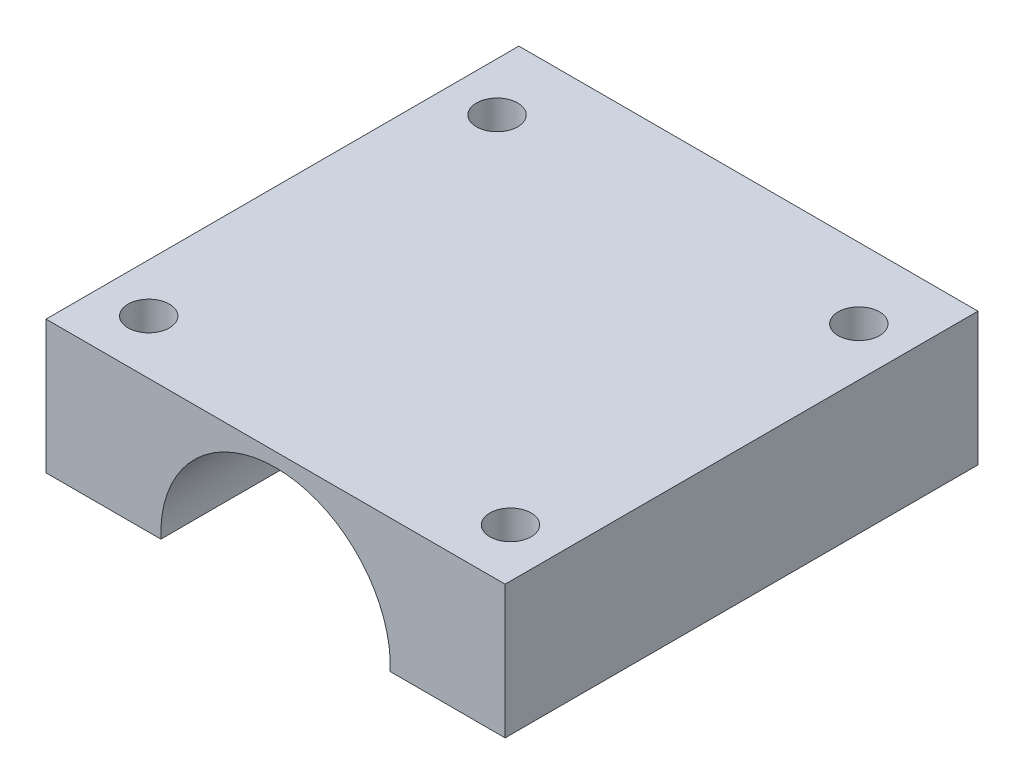
ISO-10303-21;
HEADER;
FILE_DESCRIPTION(('STEP AP214'),'2;1');
FILE_NAME('part.step','',(''),(''),'','','');
FILE_SCHEMA(('AUTOMOTIVE_DESIGN { 1 0 10303 214 1 1 1 1 }'));
ENDSEC;
DATA;
#1=APPLICATION_CONTEXT('core data for automotive mechanical design processes');
#2=APPLICATION_PROTOCOL_DEFINITION('international standard','automotive_design',2000,#1);
#3=PRODUCT_CONTEXT('',#1,'mechanical');
#4=PRODUCT('Part','Part','',(#3));
#5=PRODUCT_RELATED_PRODUCT_CATEGORY('part','',(#4));
#6=PRODUCT_DEFINITION_FORMATION('','',#4);
#7=PRODUCT_DEFINITION_CONTEXT('part definition',#1,'design');
#8=PRODUCT_DEFINITION('design','',#6,#7);
#9=PRODUCT_DEFINITION_SHAPE('','',#8);
#10=(LENGTH_UNIT() NAMED_UNIT(*) SI_UNIT(.MILLI.,.METRE.));
#11=(NAMED_UNIT(*) PLANE_ANGLE_UNIT() SI_UNIT($,.RADIAN.));
#12=(NAMED_UNIT(*) SI_UNIT($,.STERADIAN.) SOLID_ANGLE_UNIT());
#13=UNCERTAINTY_MEASURE_WITH_UNIT(LENGTH_MEASURE(1.E-05),#10,'distance_accuracy_value','');
#14=(GEOMETRIC_REPRESENTATION_CONTEXT(3) GLOBAL_UNCERTAINTY_ASSIGNED_CONTEXT((#13)) GLOBAL_UNIT_ASSIGNED_CONTEXT((#10,
#11,#12)) REPRESENTATION_CONTEXT('',''));
#15=CARTESIAN_POINT('',(0.,0.,0.));
#16=DIRECTION('',(0.,0.,1.));
#17=DIRECTION('',(1.,0.,0.));
#18=AXIS2_PLACEMENT_3D('',#15,#16,#17);
#19=CARTESIAN_POINT('',(0.,-0.499999999999995,0.));
#20=DIRECTION('',(0.,1.,0.));
#21=DIRECTION('',(0.,0.,1.));
#22=AXIS2_PLACEMENT_3D('',#19,#20,#21);
#23=PLANE('',#22);
#24=DIRECTION('',(0.,0.,1.));
#25=VECTOR('',#24,1.);
#26=CARTESIAN_POINT('',(-3.71651718682963,-0.499999999999995,-1.5));
#27=LINE('',#26,#25);
#28=CARTESIAN_POINT('',(-3.71651718682963,-0.499999999999995,-1.5));
#29=VERTEX_POINT('',#28);
#30=CARTESIAN_POINT('',(-3.71651718682963,-0.499999999999995,0.));
#31=VERTEX_POINT('',#30);
#32=EDGE_CURVE('E207',#29,#31,#27,.T.);
#33=ORIENTED_EDGE('',*,*,#32,.T.);
#34=DIRECTION('',(-1.,0.,0.));
#35=VECTOR('',#34,1.);
#36=CARTESIAN_POINT('',(0.,-0.499999999999995,0.));
#37=LINE('',#36,#35);
#38=CARTESIAN_POINT('',(-6.87519231907281,-0.499999999999995,0.));
#39=VERTEX_POINT('',#38);
#40=EDGE_CURVE('E208',#31,#39,#37,.T.);
#41=ORIENTED_EDGE('',*,*,#40,.T.);
#42=DIRECTION('',(0.,0.,-1.));
#43=VECTOR('',#42,1.);
#44=CARTESIAN_POINT('',(-6.87519231907281,-0.499999999999995,-1.5));
#45=LINE('',#44,#43);
#46=CARTESIAN_POINT('',(-6.87519231907281,-0.499999999999996,-1.5));
#47=VERTEX_POINT('',#46);
#48=EDGE_CURVE('E220',#47,#39,#45,.F.);
#49=ORIENTED_EDGE('',*,*,#48,.F.);
#50=DIRECTION('',(-1.,0.,0.));
#51=VECTOR('',#50,1.);
#52=CARTESIAN_POINT('',(0.,-0.499999999999995,-1.5));
#53=LINE('',#52,#51);
#54=EDGE_CURVE('E259',#29,#47,#53,.T.);
#55=ORIENTED_EDGE('',*,*,#54,.F.);
#56=EDGE_LOOP('',(#33,#41,#49,#55));
#57=FACE_BOUND('',#56,.T.);
#58=ADVANCED_FACE('F39',(#57),#23,.F.);
#59=CARTESIAN_POINT('',(-19.6986749407734,-0.499999999999995,6.17682172326088));
#60=DIRECTION('',(0.,1.,0.));
#61=DIRECTION('',(0.,0.,1.));
#62=AXIS2_PLACEMENT_3D('',#59,#60,#61);
#63=CIRCLE('',#62,2.25);
#64=CARTESIAN_POINT('',(-19.6986749407734,-0.499999999999995,8.42682172326087));
#65=VERTEX_POINT('',#64);
#66=EDGE_CURVE('E227',#65,#65,#63,.F.);
#67=ORIENTED_EDGE('',*,*,#66,.F.);
#68=EDGE_LOOP('',(#67));
#69=FACE_BOUND('',#68,.T.);
#70=DIRECTION('',(-1.,0.,0.));
#71=VECTOR('',#70,1.);
#72=CARTESIAN_POINT('',(0.,-0.499999999999995,50.));
#73=LINE('',#72,#71);
#74=CARTESIAN_POINT('',(-12.4899959967968,-0.499999999999995,50.));
#75=VERTEX_POINT('',#74);
#76=CARTESIAN_POINT('',(-25.,-0.500000000000001,50.));
#77=VERTEX_POINT('',#76);
#78=EDGE_CURVE('E216',#75,#77,#73,.T.);
#79=ORIENTED_EDGE('',*,*,#78,.T.);
#80=DIRECTION('',(0.,0.,-1.));
#81=VECTOR('',#80,1.);
#82=CARTESIAN_POINT('',(-25.,-0.500000000000001,50.));
#83=LINE('',#82,#81);
#84=CARTESIAN_POINT('',(-25.,-0.500000000000001,-1.5));
#85=VERTEX_POINT('',#84);
#86=EDGE_CURVE('E11',#77,#85,#83,.T.);
#87=ORIENTED_EDGE('',*,*,#86,.T.);
#88=CARTESIAN_POINT('',(-10.1248076809272,-0.499999999999996,-1.5));
#89=VERTEX_POINT('',#88);
#90=EDGE_CURVE('E56',#89,#85,#53,.T.);
#91=ORIENTED_EDGE('',*,*,#90,.F.);
#92=DIRECTION('',(0.,0.,-1.));
#93=VECTOR('',#92,1.);
#94=CARTESIAN_POINT('',(-10.1248076809272,-0.499999999999995,-1.5));
#95=LINE('',#94,#93);
#96=CARTESIAN_POINT('',(-10.1248076809272,-0.499999999999995,0.));
#97=VERTEX_POINT('',#96);
#98=EDGE_CURVE('E202',#97,#89,#95,.T.);
#99=ORIENTED_EDGE('',*,*,#98,.F.);
#100=CARTESIAN_POINT('',(-12.4899959967968,-0.499999999999995,0.));
#101=VERTEX_POINT('',#100);
#102=EDGE_CURVE('E204',#97,#101,#37,.T.);
#103=ORIENTED_EDGE('',*,*,#102,.T.);
#104=DIRECTION('',(0.,0.,-1.));
#105=VECTOR('',#104,1.);
#106=CARTESIAN_POINT('',(-12.4899959967968,-0.499999999999995,50.));
#107=LINE('',#106,#105);
#108=EDGE_CURVE('E215',#101,#75,#107,.F.);
#109=ORIENTED_EDGE('',*,*,#108,.T.);
#110=EDGE_LOOP('',(#79,#87,#91,#99,#103,#109));
#111=FACE_BOUND('',#110,.T.);
#112=CARTESIAN_POINT('',(-19.6986749407734,-0.499999999999995,44.1150104980837));
#113=DIRECTION('',(0.,1.,0.));
#114=DIRECTION('',(0.,0.,1.));
#115=AXIS2_PLACEMENT_3D('',#112,#113,#114);
#116=CIRCLE('',#115,2.25);
#117=CARTESIAN_POINT('',(-19.6986749407734,-0.499999999999995,46.3650104980837));
#118=VERTEX_POINT('',#117);
#119=EDGE_CURVE('E229',#118,#118,#116,.F.);
#120=ORIENTED_EDGE('',*,*,#119,.F.);
#121=EDGE_LOOP('',(#120));
#122=FACE_BOUND('',#121,.T.);
#123=ADVANCED_FACE('F239',(#69,#111,#122),#23,.F.);
#124=CARTESIAN_POINT('',(19.6986749407734,-0.499999999999995,6.17682172326088));
#125=DIRECTION('',(0.,1.,0.));
#126=DIRECTION('',(0.,0.,1.));
#127=AXIS2_PLACEMENT_3D('',#124,#125,#126);
#128=CIRCLE('',#127,2.25);
#129=CARTESIAN_POINT('',(19.6986749407734,-0.499999999999995,8.42682172326087));
#130=VERTEX_POINT('',#129);
#131=EDGE_CURVE('E152',#130,#130,#128,.F.);
#132=ORIENTED_EDGE('',*,*,#131,.F.);
#133=EDGE_LOOP('',(#132));
#134=FACE_BOUND('',#133,.T.);
#135=CARTESIAN_POINT('',(25.,-0.499999999999995,50.));
#136=VERTEX_POINT('',#135);
#137=CARTESIAN_POINT('',(12.4899959967968,-0.499999999999995,50.));
#138=VERTEX_POINT('',#137);
#139=EDGE_CURVE('E218',#136,#138,#73,.T.);
#140=ORIENTED_EDGE('',*,*,#139,.T.);
#141=DIRECTION('',(0.,0.,-1.));
#142=VECTOR('',#141,1.);
#143=CARTESIAN_POINT('',(12.4899959967968,-0.499999999999995,50.));
#144=LINE('',#143,#142);
#145=CARTESIAN_POINT('',(12.4899959967968,-0.499999999999995,0.));
#146=VERTEX_POINT('',#145);
#147=EDGE_CURVE('E212',#138,#146,#144,.T.);
#148=ORIENTED_EDGE('',*,*,#147,.T.);
#149=CARTESIAN_POINT('',(10.1248076809272,-0.499999999999995,0.));
#150=VERTEX_POINT('',#149);
#151=EDGE_CURVE('E209',#146,#150,#37,.T.);
#152=ORIENTED_EDGE('',*,*,#151,.T.);
#153=DIRECTION('',(0.,0.,-1.));
#154=VECTOR('',#153,1.);
#155=CARTESIAN_POINT('',(10.1248076809272,-0.499999999999995,-1.5));
#156=LINE('',#155,#154);
#157=CARTESIAN_POINT('',(10.1248076809272,-0.499999999999996,-1.5));
#158=VERTEX_POINT('',#157);
#159=EDGE_CURVE('E149',#158,#150,#156,.F.);
#160=ORIENTED_EDGE('',*,*,#159,.F.);
#161=CARTESIAN_POINT('',(25.,-0.499999999999995,-1.5));
#162=VERTEX_POINT('',#161);
#163=EDGE_CURVE('E145',#162,#158,#53,.T.);
#164=ORIENTED_EDGE('',*,*,#163,.F.);
#165=DIRECTION('',(0.,0.,-1.));
#166=VECTOR('',#165,1.);
#167=CARTESIAN_POINT('',(25.,-0.499999999999995,50.));
#168=LINE('',#167,#166);
#169=EDGE_CURVE('E131',#136,#162,#168,.T.);
#170=ORIENTED_EDGE('',*,*,#169,.F.);
#171=EDGE_LOOP('',(#140,#148,#152,#160,#164,#170));
#172=FACE_BOUND('',#171,.T.);
#173=CARTESIAN_POINT('',(19.6986749407734,-0.499999999999995,44.1150104980837));
#174=DIRECTION('',(0.,1.,0.));
#175=DIRECTION('',(0.,0.,1.));
#176=AXIS2_PLACEMENT_3D('',#173,#174,#175);
#177=CIRCLE('',#176,2.25);
#178=CARTESIAN_POINT('',(19.6986749407734,-0.499999999999995,46.3650104980837));
#179=VERTEX_POINT('',#178);
#180=EDGE_CURVE('E43',#179,#179,#177,.F.);
#181=ORIENTED_EDGE('',*,*,#180,.F.);
#182=EDGE_LOOP('',(#181));
#183=FACE_BOUND('',#182,.T.);
#184=ADVANCED_FACE('F146',(#134,#172,#183),#23,.F.);
#185=DIRECTION('',(0.,0.,1.));
#186=VECTOR('',#185,1.);
#187=CARTESIAN_POINT('',(3.71651718682963,-0.499999999999995,-1.5));
#188=LINE('',#187,#186);
#189=CARTESIAN_POINT('',(3.71651718682963,-0.499999999999995,0.));
#190=VERTEX_POINT('',#189);
#191=CARTESIAN_POINT('',(3.71651718682963,-0.499999999999995,-1.5));
#192=VERTEX_POINT('',#191);
#193=EDGE_CURVE('E48',#190,#192,#188,.F.);
#194=ORIENTED_EDGE('',*,*,#193,.T.);
#195=CARTESIAN_POINT('',(6.87519231907281,-0.499999999999996,-1.5));
#196=VERTEX_POINT('',#195);
#197=EDGE_CURVE('E153',#196,#192,#53,.T.);
#198=ORIENTED_EDGE('',*,*,#197,.F.);
#199=DIRECTION('',(0.,0.,-1.));
#200=VECTOR('',#199,1.);
#201=CARTESIAN_POINT('',(6.87519231907281,-0.499999999999995,-1.5));
#202=LINE('',#201,#200);
#203=CARTESIAN_POINT('',(6.87519231907281,-0.499999999999995,0.));
#204=VERTEX_POINT('',#203);
#205=EDGE_CURVE('E195',#204,#196,#202,.T.);
#206=ORIENTED_EDGE('',*,*,#205,.F.);
#207=EDGE_CURVE('E277',#204,#190,#37,.T.);
#208=ORIENTED_EDGE('',*,*,#207,.T.);
#209=EDGE_LOOP('',(#194,#198,#206,#208));
#210=FACE_BOUND('',#209,.T.);
#211=ADVANCED_FACE('F41',(#210),#23,.F.);
#212=CARTESIAN_POINT('',(0.,0.,50.));
#213=DIRECTION('',(0.,0.,-1.));
#214=DIRECTION('',(-1.,0.,0.));
#215=AXIS2_PLACEMENT_3D('',#212,#213,#214);
#216=CYLINDRICAL_SURFACE('',#215,12.5);
#217=ORIENTED_EDGE('',*,*,#147,.F.);
#218=CARTESIAN_POINT('',(0.,0.,50.));
#219=DIRECTION('',(0.,0.,1.));
#220=DIRECTION('',(1.,0.,0.));
#221=AXIS2_PLACEMENT_3D('',#218,#219,#220);
#222=CIRCLE('',#221,12.5);
#223=EDGE_CURVE('E188',#138,#75,#222,.T.);
#224=ORIENTED_EDGE('',*,*,#223,.T.);
#225=ORIENTED_EDGE('',*,*,#108,.F.);
#226=CARTESIAN_POINT('',(0.,0.,0.));
#227=DIRECTION('',(0.,0.,1.));
#228=DIRECTION('',(1.,0.,0.));
#229=AXIS2_PLACEMENT_3D('',#226,#227,#228);
#230=CIRCLE('',#229,12.5);
#231=EDGE_CURVE('E181',#146,#101,#230,.T.);
#232=ORIENTED_EDGE('',*,*,#231,.F.);
#233=EDGE_LOOP('',(#217,#224,#225,#232));
#234=FACE_BOUND('',#233,.T.);
#235=ADVANCED_FACE('F245',(#234),#216,.F.);
#236=CARTESIAN_POINT('',(0.,14.,50.));
#237=DIRECTION('',(0.,1.,0.));
#238=DIRECTION('',(0.,0.,1.));
#239=AXIS2_PLACEMENT_3D('',#236,#237,#238);
#240=PLANE('',#239);
#241=CARTESIAN_POINT('',(19.6986749407734,14.,6.17682172326088));
#242=DIRECTION('',(0.,-1.,0.));
#243=DIRECTION('',(0.,0.,-1.));
#244=AXIS2_PLACEMENT_3D('',#241,#242,#243);
#245=CIRCLE('',#244,2.24999999999999);
#246=CARTESIAN_POINT('',(19.6986749407734,14.,3.92682172326089));
#247=VERTEX_POINT('',#246);
#248=EDGE_CURVE('E169',#247,#247,#245,.T.);
#249=ORIENTED_EDGE('',*,*,#248,.T.);
#250=EDGE_LOOP('',(#249));
#251=FACE_BOUND('',#250,.T.);
#252=CARTESIAN_POINT('',(-19.6986749407734,14.,6.17682172326088));
#253=DIRECTION('',(0.,-1.,0.));
#254=DIRECTION('',(0.,0.,-1.));
#255=AXIS2_PLACEMENT_3D('',#252,#253,#254);
#256=CIRCLE('',#255,2.24999999999999);
#257=CARTESIAN_POINT('',(-19.6986749407734,14.,3.92682172326089));
#258=VERTEX_POINT('',#257);
#259=EDGE_CURVE('E172',#258,#258,#256,.T.);
#260=ORIENTED_EDGE('',*,*,#259,.T.);
#261=EDGE_LOOP('',(#260));
#262=FACE_BOUND('',#261,.T.);
#263=CARTESIAN_POINT('',(-19.6986749407734,14.,44.1150104980837));
#264=DIRECTION('',(0.,-1.,0.));
#265=DIRECTION('',(0.,0.,-1.));
#266=AXIS2_PLACEMENT_3D('',#263,#264,#265);
#267=CIRCLE('',#266,2.24999999999999);
#268=CARTESIAN_POINT('',(-19.6986749407734,14.,41.8650104980837));
#269=VERTEX_POINT('',#268);
#270=EDGE_CURVE('E175',#269,#269,#267,.T.);
#271=ORIENTED_EDGE('',*,*,#270,.T.);
#272=EDGE_LOOP('',(#271));
#273=FACE_BOUND('',#272,.T.);
#274=CARTESIAN_POINT('',(19.6986749407734,14.,44.1150104980837));
#275=DIRECTION('',(0.,-1.,0.));
#276=DIRECTION('',(0.,0.,-1.));
#277=AXIS2_PLACEMENT_3D('',#274,#275,#276);
#278=CIRCLE('',#277,2.24999999999999);
#279=CARTESIAN_POINT('',(19.6986749407734,14.,41.8650104980837));
#280=VERTEX_POINT('',#279);
#281=EDGE_CURVE('E178',#280,#280,#278,.T.);
#282=ORIENTED_EDGE('',*,*,#281,.T.);
#283=EDGE_LOOP('',(#282));
#284=FACE_BOUND('',#283,.T.);
#285=DIRECTION('',(0.,0.,-1.));
#286=VECTOR('',#285,1.);
#287=CARTESIAN_POINT('',(25.,14.,50.));
#288=LINE('',#287,#286);
#289=CARTESIAN_POINT('',(25.,14.,50.));
#290=VERTEX_POINT('',#289);
#291=CARTESIAN_POINT('',(25.,14.,-1.5));
#292=VERTEX_POINT('',#291);
#293=EDGE_CURVE('E142',#290,#292,#288,.T.);
#294=ORIENTED_EDGE('',*,*,#293,.T.);
#295=DIRECTION('',(1.,0.,0.));
#296=VECTOR('',#295,1.);
#297=CARTESIAN_POINT('',(25.,14.,-1.5));
#298=LINE('',#297,#296);
#299=CARTESIAN_POINT('',(-25.,14.,-1.5));
#300=VERTEX_POINT('',#299);
#301=EDGE_CURVE('E158',#300,#292,#298,.T.);
#302=ORIENTED_EDGE('',*,*,#301,.F.);
#303=DIRECTION('',(0.,0.,-1.));
#304=VECTOR('',#303,1.);
#305=CARTESIAN_POINT('',(-25.,14.,50.));
#306=LINE('',#305,#304);
#307=CARTESIAN_POINT('',(-25.,14.,50.));
#308=VERTEX_POINT('',#307);
#309=EDGE_CURVE('E141',#308,#300,#306,.T.);
#310=ORIENTED_EDGE('',*,*,#309,.F.);
#311=DIRECTION('',(1.,0.,0.));
#312=VECTOR('',#311,1.);
#313=CARTESIAN_POINT('',(0.,14.,50.));
#314=LINE('',#313,#312);
#315=EDGE_CURVE('E182',#308,#290,#314,.T.);
#316=ORIENTED_EDGE('',*,*,#315,.T.);
#317=EDGE_LOOP('',(#294,#302,#310,#316));
#318=FACE_BOUND('',#317,.T.);
#319=ADVANCED_FACE('F309',(#251,#262,#273,#284,#318),#240,.T.);
#320=CARTESIAN_POINT('',(-25.,0.,50.));
#321=DIRECTION('',(-1.,0.,0.));
#322=DIRECTION('',(0.,0.,1.));
#323=AXIS2_PLACEMENT_3D('',#320,#321,#322);
#324=PLANE('',#323);
#325=ORIENTED_EDGE('',*,*,#309,.T.);
#326=DIRECTION('',(0.,1.,0.));
#327=VECTOR('',#326,1.);
#328=CARTESIAN_POINT('',(-25.,14.,-1.5));
#329=LINE('',#328,#327);
#330=EDGE_CURVE('E159',#85,#300,#329,.T.);
#331=ORIENTED_EDGE('',*,*,#330,.F.);
#332=ORIENTED_EDGE('',*,*,#86,.F.);
#333=DIRECTION('',(0.,1.,0.));
#334=VECTOR('',#333,1.);
#335=CARTESIAN_POINT('',(-25.,0.,50.));
#336=LINE('',#335,#334);
#337=EDGE_CURVE('E185',#77,#308,#336,.T.);
#338=ORIENTED_EDGE('',*,*,#337,.T.);
#339=EDGE_LOOP('',(#325,#331,#332,#338));
#340=FACE_BOUND('',#339,.T.);
#341=ADVANCED_FACE('F288',(#340),#324,.T.);
#342=CARTESIAN_POINT('',(25.,0.,50.));
#343=DIRECTION('',(1.,0.,0.));
#344=DIRECTION('',(0.,1.,0.));
#345=AXIS2_PLACEMENT_3D('',#342,#343,#344);
#346=PLANE('',#345);
#347=ORIENTED_EDGE('',*,*,#169,.T.);
#348=DIRECTION('',(0.,-1.,0.));
#349=VECTOR('',#348,1.);
#350=CARTESIAN_POINT('',(25.,-0.499999999999995,-1.5));
#351=LINE('',#350,#349);
#352=EDGE_CURVE('E135',#292,#162,#351,.T.);
#353=ORIENTED_EDGE('',*,*,#352,.F.);
#354=ORIENTED_EDGE('',*,*,#293,.F.);
#355=DIRECTION('',(0.,-1.,0.));
#356=VECTOR('',#355,1.);
#357=CARTESIAN_POINT('',(25.,0.,50.));
#358=LINE('',#357,#356);
#359=EDGE_CURVE('E137',#290,#136,#358,.T.);
#360=ORIENTED_EDGE('',*,*,#359,.T.);
#361=EDGE_LOOP('',(#347,#353,#354,#360));
#362=FACE_BOUND('',#361,.T.);
#363=ADVANCED_FACE('F133',(#362),#346,.T.);
#364=CARTESIAN_POINT('',(0.,0.,0.));
#365=DIRECTION('',(0.,0.,1.));
#366=DIRECTION('',(1.,0.,0.));
#367=AXIS2_PLACEMENT_3D('',#364,#365,#366);
#368=PLANE('',#367);
#369=ORIENTED_EDGE('',*,*,#151,.F.);
#370=ORIENTED_EDGE('',*,*,#231,.T.);
#371=ORIENTED_EDGE('',*,*,#102,.F.);
#372=CARTESIAN_POINT('',(-8.5,0.,0.));
#373=DIRECTION('',(0.,0.,1.));
#374=DIRECTION('',(1.,0.,0.));
#375=AXIS2_PLACEMENT_3D('',#372,#373,#374);
#376=CIRCLE('',#375,1.7);
#377=EDGE_CURVE('E266',#39,#97,#376,.T.);
#378=ORIENTED_EDGE('',*,*,#377,.F.);
#379=ORIENTED_EDGE('',*,*,#40,.F.);
#380=CARTESIAN_POINT('',(0.,0.,0.));
#381=DIRECTION('',(0.,0.,-1.));
#382=DIRECTION('',(-1.,0.,0.));
#383=AXIS2_PLACEMENT_3D('',#380,#381,#382);
#384=CIRCLE('',#383,3.75);
#385=EDGE_CURVE('E164',#31,#190,#384,.T.);
#386=ORIENTED_EDGE('',*,*,#385,.T.);
#387=ORIENTED_EDGE('',*,*,#207,.F.);
#388=CARTESIAN_POINT('',(8.5,0.,0.));
#389=DIRECTION('',(0.,0.,1.));
#390=DIRECTION('',(1.,0.,0.));
#391=AXIS2_PLACEMENT_3D('',#388,#389,#390);
#392=CIRCLE('',#391,1.7);
#393=EDGE_CURVE('E196',#150,#204,#392,.T.);
#394=ORIENTED_EDGE('',*,*,#393,.F.);
#395=EDGE_LOOP('',(#369,#370,#371,#378,#379,#386,#387,#394));
#396=FACE_BOUND('',#395,.T.);
#397=ADVANCED_FACE('F280',(#396),#368,.T.);
#398=CARTESIAN_POINT('',(0.,0.,-1.5));
#399=DIRECTION('',(0.,0.,1.));
#400=DIRECTION('',(1.,0.,0.));
#401=AXIS2_PLACEMENT_3D('',#398,#399,#400);
#402=PLANE('',#401);
#403=ORIENTED_EDGE('',*,*,#352,.T.);
#404=ORIENTED_EDGE('',*,*,#163,.T.);
#405=CARTESIAN_POINT('',(8.5,0.,-1.5));
#406=DIRECTION('',(0.,0.,-1.));
#407=DIRECTION('',(-1.,0.,0.));
#408=AXIS2_PLACEMENT_3D('',#405,#406,#407);
#409=CIRCLE('',#408,1.7);
#410=EDGE_CURVE('E200',#196,#158,#409,.T.);
#411=ORIENTED_EDGE('',*,*,#410,.F.);
#412=ORIENTED_EDGE('',*,*,#197,.T.);
#413=CARTESIAN_POINT('',(0.,0.,-1.5));
#414=DIRECTION('',(0.,0.,-1.));
#415=DIRECTION('',(-1.,0.,0.));
#416=AXIS2_PLACEMENT_3D('',#413,#414,#415);
#417=CIRCLE('',#416,3.75);
#418=EDGE_CURVE('E160',#29,#192,#417,.T.);
#419=ORIENTED_EDGE('',*,*,#418,.F.);
#420=ORIENTED_EDGE('',*,*,#54,.T.);
#421=CARTESIAN_POINT('',(-8.5,0.,-1.5));
#422=DIRECTION('',(0.,0.,-1.));
#423=DIRECTION('',(-1.,0.,0.));
#424=AXIS2_PLACEMENT_3D('',#421,#422,#423);
#425=CIRCLE('',#424,1.7);
#426=EDGE_CURVE('E199',#89,#47,#425,.T.);
#427=ORIENTED_EDGE('',*,*,#426,.F.);
#428=ORIENTED_EDGE('',*,*,#90,.T.);
#429=ORIENTED_EDGE('',*,*,#330,.T.);
#430=ORIENTED_EDGE('',*,*,#301,.T.);
#431=EDGE_LOOP('',(#403,#404,#411,#412,#419,#420,#427,#428,#429,#430));
#432=FACE_BOUND('',#431,.T.);
#433=ADVANCED_FACE('F156',(#432),#402,.F.);
#434=CARTESIAN_POINT('',(8.5,0.,-1.5));
#435=DIRECTION('',(0.,0.,-1.));
#436=DIRECTION('',(-1.,0.,0.));
#437=AXIS2_PLACEMENT_3D('',#434,#435,#436);
#438=CYLINDRICAL_SURFACE('',#437,1.7);
#439=ORIENTED_EDGE('',*,*,#410,.T.);
#440=ORIENTED_EDGE('',*,*,#159,.T.);
#441=ORIENTED_EDGE('',*,*,#393,.T.);
#442=ORIENTED_EDGE('',*,*,#205,.T.);
#443=EDGE_LOOP('',(#439,#440,#441,#442));
#444=FACE_BOUND('',#443,.T.);
#445=ADVANCED_FACE('F274',(#444),#438,.F.);
#446=CARTESIAN_POINT('',(-8.5,0.,-1.5));
#447=DIRECTION('',(0.,0.,-1.));
#448=DIRECTION('',(-1.,0.,0.));
#449=AXIS2_PLACEMENT_3D('',#446,#447,#448);
#450=CYLINDRICAL_SURFACE('',#449,1.7);
#451=ORIENTED_EDGE('',*,*,#426,.T.);
#452=ORIENTED_EDGE('',*,*,#48,.T.);
#453=ORIENTED_EDGE('',*,*,#377,.T.);
#454=ORIENTED_EDGE('',*,*,#98,.T.);
#455=EDGE_LOOP('',(#451,#452,#453,#454));
#456=FACE_BOUND('',#455,.T.);
#457=ADVANCED_FACE('F332',(#456),#450,.F.);
#458=CARTESIAN_POINT('',(0.,0.,-1.5));
#459=DIRECTION('',(0.,0.,1.));
#460=DIRECTION('',(1.,0.,0.));
#461=AXIS2_PLACEMENT_3D('',#458,#459,#460);
#462=CYLINDRICAL_SURFACE('',#461,3.75);
#463=ORIENTED_EDGE('',*,*,#32,.F.);
#464=ORIENTED_EDGE('',*,*,#418,.T.);
#465=ORIENTED_EDGE('',*,*,#193,.F.);
#466=ORIENTED_EDGE('',*,*,#385,.F.);
#467=EDGE_LOOP('',(#463,#464,#465,#466));
#468=FACE_BOUND('',#467,.T.);
#469=ADVANCED_FACE('F264',(#468),#462,.F.);
#470=CARTESIAN_POINT('',(19.6986749407734,-15.,6.17682172326088));
#471=DIRECTION('',(0.,-1.,0.));
#472=DIRECTION('',(0.,0.,-1.));
#473=AXIS2_PLACEMENT_3D('',#470,#471,#472);
#474=CYLINDRICAL_SURFACE('',#473,2.25);
#475=ORIENTED_EDGE('',*,*,#131,.T.);
#476=EDGE_LOOP('',(#475));
#477=FACE_BOUND('',#476,.T.);
#478=ORIENTED_EDGE('',*,*,#248,.F.);
#479=EDGE_LOOP('',(#478));
#480=FACE_BOUND('',#479,.T.);
#481=ADVANCED_FACE('F292',(#477,#480),#474,.F.);
#482=CARTESIAN_POINT('',(-19.6986749407734,-15.,6.17682172326088));
#483=DIRECTION('',(0.,-1.,0.));
#484=DIRECTION('',(0.,0.,-1.));
#485=AXIS2_PLACEMENT_3D('',#482,#483,#484);
#486=CYLINDRICAL_SURFACE('',#485,2.25);
#487=ORIENTED_EDGE('',*,*,#66,.T.);
#488=EDGE_LOOP('',(#487));
#489=FACE_BOUND('',#488,.T.);
#490=ORIENTED_EDGE('',*,*,#259,.F.);
#491=EDGE_LOOP('',(#490));
#492=FACE_BOUND('',#491,.T.);
#493=ADVANCED_FACE('F295',(#489,#492),#486,.F.);
#494=CARTESIAN_POINT('',(-19.6986749407734,-15.,44.1150104980837));
#495=DIRECTION('',(0.,-1.,0.));
#496=DIRECTION('',(0.,0.,-1.));
#497=AXIS2_PLACEMENT_3D('',#494,#495,#496);
#498=CYLINDRICAL_SURFACE('',#497,2.25);
#499=ORIENTED_EDGE('',*,*,#119,.T.);
#500=EDGE_LOOP('',(#499));
#501=FACE_BOUND('',#500,.T.);
#502=ORIENTED_EDGE('',*,*,#270,.F.);
#503=EDGE_LOOP('',(#502));
#504=FACE_BOUND('',#503,.T.);
#505=ADVANCED_FACE('F299',(#501,#504),#498,.F.);
#506=CARTESIAN_POINT('',(19.6986749407734,-15.,44.1150104980837));
#507=DIRECTION('',(0.,-1.,0.));
#508=DIRECTION('',(0.,0.,-1.));
#509=AXIS2_PLACEMENT_3D('',#506,#507,#508);
#510=CYLINDRICAL_SURFACE('',#509,2.25);
#511=ORIENTED_EDGE('',*,*,#180,.T.);
#512=EDGE_LOOP('',(#511));
#513=FACE_BOUND('',#512,.T.);
#514=ORIENTED_EDGE('',*,*,#281,.F.);
#515=EDGE_LOOP('',(#514));
#516=FACE_BOUND('',#515,.T.);
#517=ADVANCED_FACE('F236',(#513,#516),#510,.F.);
#518=CARTESIAN_POINT('',(0.,0.,50.));
#519=DIRECTION('',(0.,0.,1.));
#520=DIRECTION('',(1.,0.,0.));
#521=AXIS2_PLACEMENT_3D('',#518,#519,#520);
#522=PLANE('',#521);
#523=ORIENTED_EDGE('',*,*,#139,.F.);
#524=ORIENTED_EDGE('',*,*,#359,.F.);
#525=ORIENTED_EDGE('',*,*,#315,.F.);
#526=ORIENTED_EDGE('',*,*,#337,.F.);
#527=ORIENTED_EDGE('',*,*,#78,.F.);
#528=ORIENTED_EDGE('',*,*,#223,.F.);
#529=EDGE_LOOP('',(#523,#524,#525,#526,#527,#528));
#530=FACE_BOUND('',#529,.T.);
#531=ADVANCED_FACE('F247',(#530),#522,.T.);
#532=CLOSED_SHELL('',(#58,#123,#184,#211,#235,#319,#341,#363,#397,#433,#445,#457,#469,#481,#493,
#505,#517,#531));
#533=MANIFOLD_SOLID_BREP('B2',#532);
#534=ADVANCED_BREP_SHAPE_REPRESENTATION('',(#18,#533),#14);
#535=SHAPE_DEFINITION_REPRESENTATION(#9,#534);
ENDSEC;
END-ISO-10303-21;
